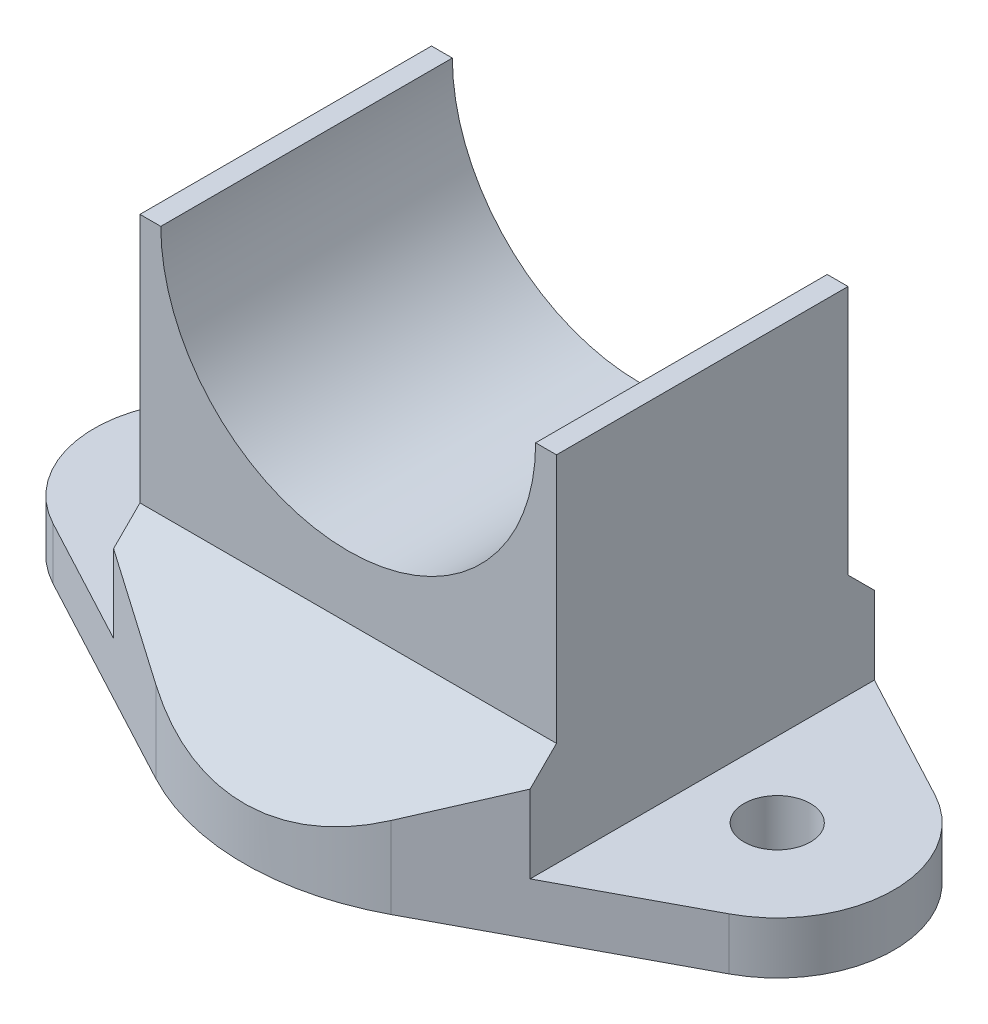
ISO-10303-21;
HEADER;
FILE_DESCRIPTION(('STEP AP214'),'2;1');
FILE_NAME('part.step','',(''),(''),'','','');
FILE_SCHEMA(('AUTOMOTIVE_DESIGN { 1 0 10303 214 1 1 1 1 }'));
ENDSEC;
DATA;
#1=APPLICATION_CONTEXT('core data for automotive mechanical design processes');
#2=APPLICATION_PROTOCOL_DEFINITION('international standard','automotive_design',2000,#1);
#3=PRODUCT_CONTEXT('',#1,'mechanical');
#4=PRODUCT('Part','Part','',(#3));
#5=PRODUCT_RELATED_PRODUCT_CATEGORY('part','',(#4));
#6=PRODUCT_DEFINITION_FORMATION('','',#4);
#7=PRODUCT_DEFINITION_CONTEXT('part definition',#1,'design');
#8=PRODUCT_DEFINITION('design','',#6,#7);
#9=PRODUCT_DEFINITION_SHAPE('','',#8);
#10=(LENGTH_UNIT() NAMED_UNIT(*) SI_UNIT(.MILLI.,.METRE.));
#11=(NAMED_UNIT(*) PLANE_ANGLE_UNIT() SI_UNIT($,.RADIAN.));
#12=(NAMED_UNIT(*) SI_UNIT($,.STERADIAN.) SOLID_ANGLE_UNIT());
#13=UNCERTAINTY_MEASURE_WITH_UNIT(LENGTH_MEASURE(1.E-05),#10,'distance_accuracy_value','');
#14=(GEOMETRIC_REPRESENTATION_CONTEXT(3) GLOBAL_UNCERTAINTY_ASSIGNED_CONTEXT((#13)) GLOBAL_UNIT_ASSIGNED_CONTEXT((#10,
#11,#12)) REPRESENTATION_CONTEXT('',''));
#15=CARTESIAN_POINT('',(0.,0.,0.));
#16=DIRECTION('',(0.,0.,1.));
#17=DIRECTION('',(1.,0.,0.));
#18=AXIS2_PLACEMENT_3D('',#15,#16,#17);
#19=CARTESIAN_POINT('',(-10.,17.,7.));
#20=DIRECTION('',(0.,1.,0.));
#21=DIRECTION('',(0.,0.,1.));
#22=AXIS2_PLACEMENT_3D('',#19,#20,#21);
#23=PLANE('',#22);
#24=DIRECTION('',(1.,0.,0.));
#25=VECTOR('',#24,1.);
#26=CARTESIAN_POINT('',(-10.,17.,-7.));
#27=LINE('',#26,#25);
#28=CARTESIAN_POINT('',(9.,17.,-7.));
#29=VERTEX_POINT('',#28);
#30=CARTESIAN_POINT('',(10.,17.,-7.));
#31=VERTEX_POINT('',#30);
#32=EDGE_CURVE('E177',#29,#31,#27,.T.);
#33=ORIENTED_EDGE('',*,*,#32,.F.);
#34=DIRECTION('',(0.,0.,-1.));
#35=VECTOR('',#34,1.);
#36=CARTESIAN_POINT('',(9.,17.,12.));
#37=LINE('',#36,#35);
#38=CARTESIAN_POINT('',(9.,17.,7.));
#39=VERTEX_POINT('',#38);
#40=EDGE_CURVE('E50',#29,#39,#37,.F.);
#41=ORIENTED_EDGE('',*,*,#40,.T.);
#42=DIRECTION('',(1.,0.,0.));
#43=VECTOR('',#42,1.);
#44=CARTESIAN_POINT('',(-10.,17.,7.));
#45=LINE('',#44,#43);
#46=CARTESIAN_POINT('',(10.,17.,7.));
#47=VERTEX_POINT('',#46);
#48=EDGE_CURVE('E176',#39,#47,#45,.T.);
#49=ORIENTED_EDGE('',*,*,#48,.T.);
#50=DIRECTION('',(0.,0.,1.));
#51=VECTOR('',#50,1.);
#52=CARTESIAN_POINT('',(10.,17.,7.));
#53=LINE('',#52,#51);
#54=EDGE_CURVE('E297',#31,#47,#53,.T.);
#55=ORIENTED_EDGE('',*,*,#54,.F.);
#56=EDGE_LOOP('',(#33,#41,#49,#55));
#57=FACE_BOUND('',#56,.T.);
#58=ADVANCED_FACE('F35',(#57),#23,.T.);
#59=CARTESIAN_POINT('',(-10.,17.,7.));
#60=VERTEX_POINT('',#59);
#61=CARTESIAN_POINT('',(-9.,17.,7.));
#62=VERTEX_POINT('',#61);
#63=EDGE_CURVE('E169',#60,#62,#45,.T.);
#64=ORIENTED_EDGE('',*,*,#63,.T.);
#65=DIRECTION('',(0.,0.,-1.));
#66=VECTOR('',#65,1.);
#67=CARTESIAN_POINT('',(-9.,17.,12.));
#68=LINE('',#67,#66);
#69=CARTESIAN_POINT('',(-9.,17.,-7.));
#70=VERTEX_POINT('',#69);
#71=EDGE_CURVE('E158',#62,#70,#68,.T.);
#72=ORIENTED_EDGE('',*,*,#71,.T.);
#73=CARTESIAN_POINT('',(-10.,17.,-7.));
#74=VERTEX_POINT('',#73);
#75=EDGE_CURVE('E167',#74,#70,#27,.T.);
#76=ORIENTED_EDGE('',*,*,#75,.F.);
#77=DIRECTION('',(0.,0.,1.));
#78=VECTOR('',#77,1.);
#79=CARTESIAN_POINT('',(-10.,17.,7.));
#80=LINE('',#79,#78);
#81=EDGE_CURVE('E311',#74,#60,#80,.T.);
#82=ORIENTED_EDGE('',*,*,#81,.T.);
#83=EDGE_LOOP('',(#64,#72,#76,#82));
#84=FACE_BOUND('',#83,.T.);
#85=ADVANCED_FACE('F165',(#84),#23,.T.);
#86=CARTESIAN_POINT('',(-10.,5.,7.));
#87=DIRECTION('',(0.,0.707106781186547,0.707106781186548));
#88=DIRECTION('',(0.,-0.707106781186548,0.707106781186547));
#89=AXIS2_PLACEMENT_3D('',#86,#87,#88);
#90=PLANE('',#89);
#91=DIRECTION('',(-0.798369443118525,-0.425797036329879,0.425797036329879));
#92=VECTOR('',#91,1.);
#93=CARTESIAN_POINT('',(-1.88668555240795,-2.60623229461756,14.6062322946176));
#94=LINE('',#93,#92);
#95=CARTESIAN_POINT('',(10.,3.73333333333334,8.26666666666666));
#96=VERTEX_POINT('',#95);
#97=CARTESIAN_POINT('',(5.64705882352941,1.41176470588235,10.5882352941176));
#98=VERTEX_POINT('',#97);
#99=EDGE_CURVE('E282',#96,#98,#94,.T.);
#100=ORIENTED_EDGE('',*,*,#99,.F.);
#101=DIRECTION('',(0.,-0.707106781186548,0.707106781186547));
#102=VECTOR('',#101,1.);
#103=CARTESIAN_POINT('',(10.,5.,7.));
#104=LINE('',#103,#102);
#105=CARTESIAN_POINT('',(10.,5.,7.));
#106=VERTEX_POINT('',#105);
#107=EDGE_CURVE('E303',#106,#96,#104,.T.);
#108=ORIENTED_EDGE('',*,*,#107,.F.);
#109=DIRECTION('',(1.,0.,0.));
#110=VECTOR('',#109,1.);
#111=CARTESIAN_POINT('',(-10.,5.,7.));
#112=LINE('',#111,#110);
#113=CARTESIAN_POINT('',(-10.,5.,7.));
#114=VERTEX_POINT('',#113);
#115=EDGE_CURVE('E193',#114,#106,#112,.T.);
#116=ORIENTED_EDGE('',*,*,#115,.F.);
#117=DIRECTION('',(0.,-0.707106781186548,0.707106781186547));
#118=VECTOR('',#117,1.);
#119=CARTESIAN_POINT('',(-10.,5.,7.));
#120=LINE('',#119,#118);
#121=CARTESIAN_POINT('',(-10.,3.73333333333334,8.26666666666666));
#122=VERTEX_POINT('',#121);
#123=EDGE_CURVE('E185',#114,#122,#120,.T.);
#124=ORIENTED_EDGE('',*,*,#123,.T.);
#125=DIRECTION('',(-0.798369443118524,0.42579703632988,-0.425797036329879));
#126=VECTOR('',#125,1.);
#127=CARTESIAN_POINT('',(-10.8611898016997,4.19263456090652,7.80736543909348));
#128=LINE('',#127,#126);
#129=CARTESIAN_POINT('',(-5.64705882352941,1.41176470588235,10.5882352941176));
#130=VERTEX_POINT('',#129);
#131=EDGE_CURVE('E276',#130,#122,#128,.T.);
#132=ORIENTED_EDGE('',*,*,#131,.F.);
#133=CARTESIAN_POINT('',(0.,12.,0.));
#134=DIRECTION('',(0.,0.707106781186547,0.707106781186548));
#135=DIRECTION('',(0.,-0.707106781186548,0.707106781186547));
#136=AXIS2_PLACEMENT_3D('',#133,#134,#135);
#137=ELLIPSE('',#136,16.9705627484771,12.);
#138=EDGE_CURVE('E43',#98,#130,#137,.F.);
#139=ORIENTED_EDGE('',*,*,#138,.F.);
#140=EDGE_LOOP('',(#100,#108,#116,#124,#132,#139));
#141=FACE_BOUND('',#140,.T.);
#142=ADVANCED_FACE('F277',(#141),#90,.T.);
#143=CARTESIAN_POINT('',(-13.6,0.,0.));
#144=DIRECTION('',(0.,1.,0.));
#145=DIRECTION('',(0.,0.,1.));
#146=AXIS2_PLACEMENT_3D('',#143,#144,#145);
#147=PLANE('',#146);
#148=CARTESIAN_POINT('',(-13.6,0.,0.));
#149=DIRECTION('',(0.,1.,0.));
#150=DIRECTION('',(0.,0.,1.));
#151=AXIS2_PLACEMENT_3D('',#148,#149,#150);
#152=CIRCLE('',#151,1.6);
#153=CARTESIAN_POINT('',(-13.6,0.,1.6));
#154=VERTEX_POINT('',#153);
#155=EDGE_CURVE('E189',#154,#154,#152,.T.);
#156=ORIENTED_EDGE('',*,*,#155,.F.);
#157=EDGE_LOOP('',(#156));
#158=FACE_BOUND('',#157,.T.);
#159=DIRECTION('',(0.882352941176471,0.,0.470588235294117));
#160=VECTOR('',#159,1.);
#161=CARTESIAN_POINT('',(-16.2352941176471,0.,4.94117647058824));
#162=LINE('',#161,#160);
#163=CARTESIAN_POINT('',(-16.2352941176471,0.,4.94117647058824));
#164=VERTEX_POINT('',#163);
#165=CARTESIAN_POINT('',(-10.,0.,8.26666666666666));
#166=VERTEX_POINT('',#165);
#167=EDGE_CURVE('E228',#164,#166,#162,.T.);
#168=ORIENTED_EDGE('',*,*,#167,.T.);
#169=DIRECTION('',(0.,0.,-1.));
#170=VECTOR('',#169,1.);
#171=CARTESIAN_POINT('',(-10.,0.,-12.));
#172=LINE('',#171,#170);
#173=CARTESIAN_POINT('',(-10.,0.,-8.26666666666667));
#174=VERTEX_POINT('',#173);
#175=EDGE_CURVE('E243',#166,#174,#172,.T.);
#176=ORIENTED_EDGE('',*,*,#175,.T.);
#177=DIRECTION('',(-0.88235294117647,0.,0.470588235294118));
#178=VECTOR('',#177,1.);
#179=CARTESIAN_POINT('',(-16.2352941176471,0.,-4.94117647058823));
#180=LINE('',#179,#178);
#181=CARTESIAN_POINT('',(-16.2352941176471,0.,-4.94117647058823));
#182=VERTEX_POINT('',#181);
#183=EDGE_CURVE('E204',#174,#182,#180,.T.);
#184=ORIENTED_EDGE('',*,*,#183,.T.);
#185=CARTESIAN_POINT('',(-13.6,0.,0.));
#186=DIRECTION('',(0.,1.,0.));
#187=DIRECTION('',(0.,0.,1.));
#188=AXIS2_PLACEMENT_3D('',#185,#186,#187);
#189=CIRCLE('',#188,5.6);
#190=EDGE_CURVE('E197',#182,#164,#189,.T.);
#191=ORIENTED_EDGE('',*,*,#190,.T.);
#192=EDGE_LOOP('',(#168,#176,#184,#191));
#193=FACE_BOUND('',#192,.T.);
#194=ADVANCED_FACE('F358',(#158,#193),#147,.T.);
#195=CARTESIAN_POINT('',(-13.6,-2.5,0.));
#196=DIRECTION('',(0.,1.,0.));
#197=DIRECTION('',(0.,0.,1.));
#198=AXIS2_PLACEMENT_3D('',#195,#196,#197);
#199=CYLINDRICAL_SURFACE('',#198,5.6);
#200=ORIENTED_EDGE('',*,*,#190,.F.);
#201=DIRECTION('',(0.,1.,0.));
#202=VECTOR('',#201,1.);
#203=CARTESIAN_POINT('',(-16.2352941176471,-2.5,-4.94117647058823));
#204=LINE('',#203,#202);
#205=CARTESIAN_POINT('',(-16.2352941176471,-2.5,-4.94117647058823));
#206=VERTEX_POINT('',#205);
#207=EDGE_CURVE('E240',#206,#182,#204,.T.);
#208=ORIENTED_EDGE('',*,*,#207,.F.);
#209=CARTESIAN_POINT('',(-13.6,-2.5,0.));
#210=DIRECTION('',(0.,1.,0.));
#211=DIRECTION('',(0.,0.,1.));
#212=AXIS2_PLACEMENT_3D('',#209,#210,#211);
#213=CIRCLE('',#212,5.6);
#214=CARTESIAN_POINT('',(-16.2352941176471,-2.5,4.94117647058824));
#215=VERTEX_POINT('',#214);
#216=EDGE_CURVE('E200',#206,#215,#213,.T.);
#217=ORIENTED_EDGE('',*,*,#216,.T.);
#218=DIRECTION('',(0.,1.,0.));
#219=VECTOR('',#218,1.);
#220=CARTESIAN_POINT('',(-16.2352941176471,-2.5,4.94117647058824));
#221=LINE('',#220,#219);
#222=EDGE_CURVE('E225',#215,#164,#221,.T.);
#223=ORIENTED_EDGE('',*,*,#222,.T.);
#224=EDGE_LOOP('',(#200,#208,#217,#223));
#225=FACE_BOUND('',#224,.T.);
#226=ADVANCED_FACE('F37',(#225),#199,.T.);
#227=CARTESIAN_POINT('',(-16.2352941176471,-2.5,-4.94117647058823));
#228=DIRECTION('',(-0.470588235294118,0.,-0.882352941176471));
#229=DIRECTION('',(-0.882352941176471,0.,0.470588235294118));
#230=AXIS2_PLACEMENT_3D('',#227,#228,#229);
#231=PLANE('',#230);
#232=ORIENTED_EDGE('',*,*,#183,.F.);
#233=DIRECTION('',(0.,1.,0.));
#234=VECTOR('',#233,1.);
#235=CARTESIAN_POINT('',(-10.,0.,-8.26666666666667));
#236=LINE('',#235,#234);
#237=CARTESIAN_POINT('',(-10.,3.73333333333334,-8.26666666666667));
#238=VERTEX_POINT('',#237);
#239=EDGE_CURVE('E265',#174,#238,#236,.T.);
#240=ORIENTED_EDGE('',*,*,#239,.T.);
#241=DIRECTION('',(0.798369443118524,-0.42579703632988,-0.425797036329879));
#242=VECTOR('',#241,1.);
#243=CARTESIAN_POINT('',(-10.8611898016997,4.19263456090652,-7.80736543909348));
#244=LINE('',#243,#242);
#245=CARTESIAN_POINT('',(-5.64705882352941,1.41176470588235,-10.5882352941176));
#246=VERTEX_POINT('',#245);
#247=EDGE_CURVE('E281',#238,#246,#244,.T.);
#248=ORIENTED_EDGE('',*,*,#247,.T.);
#249=DIRECTION('',(0.,1.,0.));
#250=VECTOR('',#249,1.);
#251=CARTESIAN_POINT('',(-5.64705882352941,-2.5,-10.5882352941176));
#252=LINE('',#251,#250);
#253=CARTESIAN_POINT('',(-5.64705882352941,-2.5,-10.5882352941176));
#254=VERTEX_POINT('',#253);
#255=EDGE_CURVE('E244',#254,#246,#252,.T.);
#256=ORIENTED_EDGE('',*,*,#255,.F.);
#257=DIRECTION('',(-0.88235294117647,0.,0.470588235294118));
#258=VECTOR('',#257,1.);
#259=CARTESIAN_POINT('',(-16.2352941176471,-2.5,-4.94117647058823));
#260=LINE('',#259,#258);
#261=EDGE_CURVE('E222',#254,#206,#260,.T.);
#262=ORIENTED_EDGE('',*,*,#261,.T.);
#263=ORIENTED_EDGE('',*,*,#207,.T.);
#264=EDGE_LOOP('',(#232,#240,#248,#256,#262,#263));
#265=FACE_BOUND('',#264,.T.);
#266=ADVANCED_FACE('F367',(#265),#231,.T.);
#267=CARTESIAN_POINT('',(0.,-2.5,0.));
#268=DIRECTION('',(0.,1.,0.));
#269=DIRECTION('',(0.,0.,1.));
#270=AXIS2_PLACEMENT_3D('',#267,#268,#269);
#271=CYLINDRICAL_SURFACE('',#270,12.);
#272=CARTESIAN_POINT('',(0.,12.,0.));
#273=DIRECTION('',(0.,0.707106781186547,-0.707106781186548));
#274=DIRECTION('',(0.,-0.707106781186548,-0.707106781186547));
#275=AXIS2_PLACEMENT_3D('',#272,#273,#274);
#276=ELLIPSE('',#275,16.9705627484771,12.);
#277=CARTESIAN_POINT('',(5.64705882352941,1.41176470588235,-10.5882352941176));
#278=VERTEX_POINT('',#277);
#279=EDGE_CURVE('E285',#246,#278,#276,.F.);
#280=ORIENTED_EDGE('',*,*,#279,.T.);
#281=DIRECTION('',(0.,1.,0.));
#282=VECTOR('',#281,1.);
#283=CARTESIAN_POINT('',(5.64705882352941,-2.5,-10.5882352941176));
#284=LINE('',#283,#282);
#285=CARTESIAN_POINT('',(5.64705882352941,-2.5,-10.5882352941176));
#286=VERTEX_POINT('',#285);
#287=EDGE_CURVE('E246',#286,#278,#284,.T.);
#288=ORIENTED_EDGE('',*,*,#287,.F.);
#289=CARTESIAN_POINT('',(0.,-2.5,0.));
#290=DIRECTION('',(0.,1.,0.));
#291=DIRECTION('',(0.,0.,1.));
#292=AXIS2_PLACEMENT_3D('',#289,#290,#291);
#293=CIRCLE('',#292,12.);
#294=EDGE_CURVE('E219',#286,#254,#293,.T.);
#295=ORIENTED_EDGE('',*,*,#294,.T.);
#296=ORIENTED_EDGE('',*,*,#255,.T.);
#297=EDGE_LOOP('',(#280,#288,#295,#296));
#298=FACE_BOUND('',#297,.T.);
#299=ADVANCED_FACE('F369',(#298),#271,.T.);
#300=CARTESIAN_POINT('',(16.2352941176471,-2.5,-4.94117647058823));
#301=DIRECTION('',(0.470588235294118,0.,-0.882352941176471));
#302=DIRECTION('',(-0.882352941176471,0.,-0.470588235294118));
#303=AXIS2_PLACEMENT_3D('',#300,#301,#302);
#304=PLANE('',#303);
#305=DIRECTION('',(-0.88235294117647,0.,-0.470588235294118));
#306=VECTOR('',#305,1.);
#307=CARTESIAN_POINT('',(16.2352941176471,0.,-4.94117647058823));
#308=LINE('',#307,#306);
#309=CARTESIAN_POINT('',(16.2352941176471,0.,-4.94117647058823));
#310=VERTEX_POINT('',#309);
#311=CARTESIAN_POINT('',(10.,0.,-8.26666666666667));
#312=VERTEX_POINT('',#311);
#313=EDGE_CURVE('E236',#310,#312,#308,.T.);
#314=ORIENTED_EDGE('',*,*,#313,.F.);
#315=DIRECTION('',(0.,1.,0.));
#316=VECTOR('',#315,1.);
#317=CARTESIAN_POINT('',(16.2352941176471,-2.5,-4.94117647058823));
#318=LINE('',#317,#316);
#319=CARTESIAN_POINT('',(16.2352941176471,-2.5,-4.94117647058823));
#320=VERTEX_POINT('',#319);
#321=EDGE_CURVE('E248',#320,#310,#318,.T.);
#322=ORIENTED_EDGE('',*,*,#321,.F.);
#323=DIRECTION('',(-0.88235294117647,0.,-0.470588235294118));
#324=VECTOR('',#323,1.);
#325=CARTESIAN_POINT('',(16.2352941176471,-2.5,-4.94117647058823));
#326=LINE('',#325,#324);
#327=EDGE_CURVE('E216',#320,#286,#326,.T.);
#328=ORIENTED_EDGE('',*,*,#327,.T.);
#329=ORIENTED_EDGE('',*,*,#287,.T.);
#330=DIRECTION('',(0.798369443118524,0.42579703632988,0.425797036329879));
#331=VECTOR('',#330,1.);
#332=CARTESIAN_POINT('',(-1.88668555240793,-2.60623229461756,-14.6062322946176));
#333=LINE('',#332,#331);
#334=CARTESIAN_POINT('',(10.,3.73333333333334,-8.26666666666667));
#335=VERTEX_POINT('',#334);
#336=EDGE_CURVE('E57',#278,#335,#333,.T.);
#337=ORIENTED_EDGE('',*,*,#336,.T.);
#338=DIRECTION('',(0.,1.,0.));
#339=VECTOR('',#338,1.);
#340=CARTESIAN_POINT('',(10.,0.,-8.26666666666667));
#341=LINE('',#340,#339);
#342=EDGE_CURVE('E258',#312,#335,#341,.T.);
#343=ORIENTED_EDGE('',*,*,#342,.F.);
#344=EDGE_LOOP('',(#314,#322,#328,#329,#337,#343));
#345=FACE_BOUND('',#344,.T.);
#346=ADVANCED_FACE('F337',(#345),#304,.T.);
#347=CARTESIAN_POINT('',(13.6,-2.5,0.));
#348=DIRECTION('',(0.,1.,0.));
#349=DIRECTION('',(0.,0.,1.));
#350=AXIS2_PLACEMENT_3D('',#347,#348,#349);
#351=CYLINDRICAL_SURFACE('',#350,5.6);
#352=CARTESIAN_POINT('',(13.6,0.,0.));
#353=DIRECTION('',(0.,1.,0.));
#354=DIRECTION('',(0.,0.,1.));
#355=AXIS2_PLACEMENT_3D('',#352,#353,#354);
#356=CIRCLE('',#355,5.6);
#357=CARTESIAN_POINT('',(16.2352941176471,0.,4.94117647058824));
#358=VERTEX_POINT('',#357);
#359=EDGE_CURVE('E233',#358,#310,#356,.T.);
#360=ORIENTED_EDGE('',*,*,#359,.F.);
#361=DIRECTION('',(0.,1.,0.));
#362=VECTOR('',#361,1.);
#363=CARTESIAN_POINT('',(16.2352941176471,-2.5,4.94117647058824));
#364=LINE('',#363,#362);
#365=CARTESIAN_POINT('',(16.2352941176471,-2.5,4.94117647058824));
#366=VERTEX_POINT('',#365);
#367=EDGE_CURVE('E250',#366,#358,#364,.T.);
#368=ORIENTED_EDGE('',*,*,#367,.F.);
#369=CARTESIAN_POINT('',(13.6,-2.5,0.));
#370=DIRECTION('',(0.,1.,0.));
#371=DIRECTION('',(0.,0.,1.));
#372=AXIS2_PLACEMENT_3D('',#369,#370,#371);
#373=CIRCLE('',#372,5.6);
#374=EDGE_CURVE('E213',#366,#320,#373,.T.);
#375=ORIENTED_EDGE('',*,*,#374,.T.);
#376=ORIENTED_EDGE('',*,*,#321,.T.);
#377=EDGE_LOOP('',(#360,#368,#375,#376));
#378=FACE_BOUND('',#377,.T.);
#379=ADVANCED_FACE('F372',(#378),#351,.T.);
#380=CARTESIAN_POINT('',(16.2352941176471,-2.5,4.94117647058824));
#381=DIRECTION('',(0.470588235294117,0.,0.882352941176471));
#382=DIRECTION('',(0.882352941176471,0.,-0.470588235294117));
#383=AXIS2_PLACEMENT_3D('',#380,#381,#382);
#384=PLANE('',#383);
#385=DIRECTION('',(0.882352941176471,0.,-0.470588235294117));
#386=VECTOR('',#385,1.);
#387=CARTESIAN_POINT('',(16.2352941176471,0.,4.94117647058824));
#388=LINE('',#387,#386);
#389=CARTESIAN_POINT('',(10.,0.,8.26666666666666));
#390=VERTEX_POINT('',#389);
#391=EDGE_CURVE('E231',#390,#358,#388,.T.);
#392=ORIENTED_EDGE('',*,*,#391,.F.);
#393=DIRECTION('',(0.,-1.,0.));
#394=VECTOR('',#393,1.);
#395=CARTESIAN_POINT('',(10.,0.,8.26666666666666));
#396=LINE('',#395,#394);
#397=EDGE_CURVE('E260',#96,#390,#396,.T.);
#398=ORIENTED_EDGE('',*,*,#397,.F.);
#399=ORIENTED_EDGE('',*,*,#99,.T.);
#400=DIRECTION('',(0.,1.,0.));
#401=VECTOR('',#400,1.);
#402=CARTESIAN_POINT('',(5.64705882352941,-2.5,10.5882352941176));
#403=LINE('',#402,#401);
#404=CARTESIAN_POINT('',(5.64705882352941,-2.5,10.5882352941176));
#405=VERTEX_POINT('',#404);
#406=EDGE_CURVE('E253',#405,#98,#403,.T.);
#407=ORIENTED_EDGE('',*,*,#406,.F.);
#408=DIRECTION('',(0.882352941176471,0.,-0.470588235294117));
#409=VECTOR('',#408,1.);
#410=CARTESIAN_POINT('',(16.2352941176471,-2.5,4.94117647058824));
#411=LINE('',#410,#409);
#412=EDGE_CURVE('E210',#405,#366,#411,.T.);
#413=ORIENTED_EDGE('',*,*,#412,.T.);
#414=ORIENTED_EDGE('',*,*,#367,.T.);
#415=EDGE_LOOP('',(#392,#398,#399,#407,#413,#414));
#416=FACE_BOUND('',#415,.T.);
#417=ADVANCED_FACE('F329',(#416),#384,.T.);
#418=CARTESIAN_POINT('',(0.,-2.5,0.));
#419=DIRECTION('',(0.,1.,0.));
#420=DIRECTION('',(0.,0.,1.));
#421=AXIS2_PLACEMENT_3D('',#418,#419,#420);
#422=CYLINDRICAL_SURFACE('',#421,12.);
#423=ORIENTED_EDGE('',*,*,#138,.T.);
#424=DIRECTION('',(0.,1.,0.));
#425=VECTOR('',#424,1.);
#426=CARTESIAN_POINT('',(-5.64705882352941,-2.5,10.5882352941176));
#427=LINE('',#426,#425);
#428=CARTESIAN_POINT('',(-5.64705882352941,-2.5,10.5882352941176));
#429=VERTEX_POINT('',#428);
#430=EDGE_CURVE('E255',#429,#130,#427,.T.);
#431=ORIENTED_EDGE('',*,*,#430,.F.);
#432=CARTESIAN_POINT('',(0.,-2.5,0.));
#433=DIRECTION('',(0.,1.,0.));
#434=DIRECTION('',(0.,0.,1.));
#435=AXIS2_PLACEMENT_3D('',#432,#433,#434);
#436=CIRCLE('',#435,12.);
#437=EDGE_CURVE('E207',#429,#405,#436,.T.);
#438=ORIENTED_EDGE('',*,*,#437,.T.);
#439=ORIENTED_EDGE('',*,*,#406,.T.);
#440=EDGE_LOOP('',(#423,#431,#438,#439));
#441=FACE_BOUND('',#440,.T.);
#442=ADVANCED_FACE('F270',(#441),#422,.T.);
#443=CARTESIAN_POINT('',(-16.2352941176471,-2.5,4.94117647058824));
#444=DIRECTION('',(-0.470588235294117,0.,0.882352941176471));
#445=DIRECTION('',(0.882352941176471,0.,0.470588235294117));
#446=AXIS2_PLACEMENT_3D('',#443,#444,#445);
#447=PLANE('',#446);
#448=ORIENTED_EDGE('',*,*,#167,.F.);
#449=ORIENTED_EDGE('',*,*,#222,.F.);
#450=DIRECTION('',(0.882352941176471,0.,0.470588235294117));
#451=VECTOR('',#450,1.);
#452=CARTESIAN_POINT('',(-16.2352941176471,-2.5,4.94117647058824));
#453=LINE('',#452,#451);
#454=EDGE_CURVE('E203',#215,#429,#453,.T.);
#455=ORIENTED_EDGE('',*,*,#454,.T.);
#456=ORIENTED_EDGE('',*,*,#430,.T.);
#457=ORIENTED_EDGE('',*,*,#131,.T.);
#458=DIRECTION('',(0.,-1.,0.));
#459=VECTOR('',#458,1.);
#460=CARTESIAN_POINT('',(-10.,0.,8.26666666666666));
#461=LINE('',#460,#459);
#462=EDGE_CURVE('E263',#122,#166,#461,.T.);
#463=ORIENTED_EDGE('',*,*,#462,.T.);
#464=EDGE_LOOP('',(#448,#449,#455,#456,#457,#463));
#465=FACE_BOUND('',#464,.T.);
#466=ADVANCED_FACE('F354',(#465),#447,.T.);
#467=CARTESIAN_POINT('',(-13.6,-2.5,0.));
#468=DIRECTION('',(0.,1.,0.));
#469=DIRECTION('',(0.,0.,1.));
#470=AXIS2_PLACEMENT_3D('',#467,#468,#469);
#471=PLANE('',#470);
#472=CARTESIAN_POINT('',(13.6,-2.5,0.));
#473=DIRECTION('',(0.,1.,0.));
#474=DIRECTION('',(0.,0.,1.));
#475=AXIS2_PLACEMENT_3D('',#472,#473,#474);
#476=CIRCLE('',#475,1.6);
#477=CARTESIAN_POINT('',(13.6,-2.5,1.6));
#478=VERTEX_POINT('',#477);
#479=EDGE_CURVE('E186',#478,#478,#476,.T.);
#480=ORIENTED_EDGE('',*,*,#479,.T.);
#481=EDGE_LOOP('',(#480));
#482=FACE_BOUND('',#481,.T.);
#483=CARTESIAN_POINT('',(-13.6,-2.5,0.));
#484=DIRECTION('',(0.,1.,0.));
#485=DIRECTION('',(0.,0.,1.));
#486=AXIS2_PLACEMENT_3D('',#483,#484,#485);
#487=CIRCLE('',#486,1.6);
#488=CARTESIAN_POINT('',(-13.6,-2.5,1.6));
#489=VERTEX_POINT('',#488);
#490=EDGE_CURVE('E194',#489,#489,#487,.T.);
#491=ORIENTED_EDGE('',*,*,#490,.T.);
#492=EDGE_LOOP('',(#491));
#493=FACE_BOUND('',#492,.T.);
#494=ORIENTED_EDGE('',*,*,#216,.F.);
#495=ORIENTED_EDGE('',*,*,#261,.F.);
#496=ORIENTED_EDGE('',*,*,#294,.F.);
#497=ORIENTED_EDGE('',*,*,#327,.F.);
#498=ORIENTED_EDGE('',*,*,#374,.F.);
#499=ORIENTED_EDGE('',*,*,#412,.F.);
#500=ORIENTED_EDGE('',*,*,#437,.F.);
#501=ORIENTED_EDGE('',*,*,#454,.F.);
#502=EDGE_LOOP('',(#494,#495,#496,#497,#498,#499,#500,#501));
#503=FACE_BOUND('',#502,.T.);
#504=ADVANCED_FACE('F364',(#482,#493,#503),#471,.F.);
#505=DIRECTION('',(0.,0.,-1.));
#506=VECTOR('',#505,1.);
#507=CARTESIAN_POINT('',(10.,0.,-12.));
#508=LINE('',#507,#506);
#509=EDGE_CURVE('E261',#390,#312,#508,.T.);
#510=ORIENTED_EDGE('',*,*,#509,.F.);
#511=ORIENTED_EDGE('',*,*,#391,.T.);
#512=ORIENTED_EDGE('',*,*,#359,.T.);
#513=ORIENTED_EDGE('',*,*,#313,.T.);
#514=EDGE_LOOP('',(#510,#511,#512,#513));
#515=FACE_BOUND('',#514,.T.);
#516=CARTESIAN_POINT('',(13.6,0.,0.));
#517=DIRECTION('',(0.,1.,0.));
#518=DIRECTION('',(0.,0.,1.));
#519=AXIS2_PLACEMENT_3D('',#516,#517,#518);
#520=CIRCLE('',#519,1.6);
#521=CARTESIAN_POINT('',(13.6,0.,1.6));
#522=VERTEX_POINT('',#521);
#523=EDGE_CURVE('E190',#522,#522,#520,.T.);
#524=ORIENTED_EDGE('',*,*,#523,.F.);
#525=EDGE_LOOP('',(#524));
#526=FACE_BOUND('',#525,.T.);
#527=ADVANCED_FACE('F333',(#515,#526),#147,.T.);
#528=CARTESIAN_POINT('',(-13.6,-2.5,0.));
#529=DIRECTION('',(0.,1.,0.));
#530=DIRECTION('',(0.,0.,1.));
#531=AXIS2_PLACEMENT_3D('',#528,#529,#530);
#532=CYLINDRICAL_SURFACE('',#531,1.6);
#533=ORIENTED_EDGE('',*,*,#490,.F.);
#534=EDGE_LOOP('',(#533));
#535=FACE_BOUND('',#534,.T.);
#536=ORIENTED_EDGE('',*,*,#155,.T.);
#537=EDGE_LOOP('',(#536));
#538=FACE_BOUND('',#537,.T.);
#539=ADVANCED_FACE('F396',(#535,#538),#532,.F.);
#540=CARTESIAN_POINT('',(13.6,-2.5,0.));
#541=DIRECTION('',(0.,1.,0.));
#542=DIRECTION('',(0.,0.,1.));
#543=AXIS2_PLACEMENT_3D('',#540,#541,#542);
#544=CYLINDRICAL_SURFACE('',#543,1.6);
#545=ORIENTED_EDGE('',*,*,#479,.F.);
#546=EDGE_LOOP('',(#545));
#547=FACE_BOUND('',#546,.T.);
#548=ORIENTED_EDGE('',*,*,#523,.T.);
#549=EDGE_LOOP('',(#548));
#550=FACE_BOUND('',#549,.T.);
#551=ADVANCED_FACE('F393',(#547,#550),#544,.F.);
#552=CARTESIAN_POINT('',(-10.,5.,-7.));
#553=DIRECTION('',(0.,0.707106781186547,-0.707106781186548));
#554=DIRECTION('',(0.,0.707106781186548,0.707106781186547));
#555=AXIS2_PLACEMENT_3D('',#552,#553,#554);
#556=PLANE('',#555);
#557=ORIENTED_EDGE('',*,*,#336,.F.);
#558=ORIENTED_EDGE('',*,*,#279,.F.);
#559=ORIENTED_EDGE('',*,*,#247,.F.);
#560=DIRECTION('',(0.,0.707106781186548,0.707106781186547));
#561=VECTOR('',#560,1.);
#562=CARTESIAN_POINT('',(-10.,5.,-7.));
#563=LINE('',#562,#561);
#564=CARTESIAN_POINT('',(-10.,5.,-7.));
#565=VERTEX_POINT('',#564);
#566=EDGE_CURVE('E306',#238,#565,#563,.T.);
#567=ORIENTED_EDGE('',*,*,#566,.T.);
#568=DIRECTION('',(1.,0.,0.));
#569=VECTOR('',#568,1.);
#570=CARTESIAN_POINT('',(-10.,5.,-7.));
#571=LINE('',#570,#569);
#572=CARTESIAN_POINT('',(10.,5.,-7.));
#573=VERTEX_POINT('',#572);
#574=EDGE_CURVE('E180',#565,#573,#571,.T.);
#575=ORIENTED_EDGE('',*,*,#574,.T.);
#576=DIRECTION('',(0.,0.707106781186548,0.707106781186547));
#577=VECTOR('',#576,1.);
#578=CARTESIAN_POINT('',(10.,5.,-7.));
#579=LINE('',#578,#577);
#580=EDGE_CURVE('E292',#335,#573,#579,.T.);
#581=ORIENTED_EDGE('',*,*,#580,.F.);
#582=EDGE_LOOP('',(#557,#558,#559,#567,#575,#581));
#583=FACE_BOUND('',#582,.T.);
#584=ADVANCED_FACE('F341',(#583),#556,.T.);
#585=CARTESIAN_POINT('',(-10.,5.,7.));
#586=DIRECTION('',(0.,0.,1.));
#587=DIRECTION('',(1.,0.,0.));
#588=AXIS2_PLACEMENT_3D('',#585,#586,#587);
#589=PLANE('',#588);
#590=ORIENTED_EDGE('',*,*,#48,.F.);
#591=CARTESIAN_POINT('',(0.,17.,7.));
#592=DIRECTION('',(0.,0.,1.));
#593=DIRECTION('',(1.,0.,0.));
#594=AXIS2_PLACEMENT_3D('',#591,#592,#593);
#595=CIRCLE('',#594,9.);
#596=EDGE_CURVE('E347',#39,#62,#595,.F.);
#597=ORIENTED_EDGE('',*,*,#596,.T.);
#598=ORIENTED_EDGE('',*,*,#63,.F.);
#599=DIRECTION('',(0.,-1.,0.));
#600=VECTOR('',#599,1.);
#601=CARTESIAN_POINT('',(-10.,5.,7.));
#602=LINE('',#601,#600);
#603=EDGE_CURVE('E313',#60,#114,#602,.T.);
#604=ORIENTED_EDGE('',*,*,#603,.T.);
#605=ORIENTED_EDGE('',*,*,#115,.T.);
#606=DIRECTION('',(0.,-1.,0.));
#607=VECTOR('',#606,1.);
#608=CARTESIAN_POINT('',(10.,5.,7.));
#609=LINE('',#608,#607);
#610=EDGE_CURVE('E300',#47,#106,#609,.T.);
#611=ORIENTED_EDGE('',*,*,#610,.F.);
#612=EDGE_LOOP('',(#590,#597,#598,#604,#605,#611));
#613=FACE_BOUND('',#612,.T.);
#614=ADVANCED_FACE('F321',(#613),#589,.T.);
#615=CARTESIAN_POINT('',(-10.,5.,-7.));
#616=DIRECTION('',(0.,0.,-1.));
#617=DIRECTION('',(-1.,0.,0.));
#618=AXIS2_PLACEMENT_3D('',#615,#616,#617);
#619=PLANE('',#618);
#620=ORIENTED_EDGE('',*,*,#75,.T.);
#621=CARTESIAN_POINT('',(0.,17.,-7.));
#622=DIRECTION('',(0.,0.,-1.));
#623=DIRECTION('',(-1.,0.,0.));
#624=AXIS2_PLACEMENT_3D('',#621,#622,#623);
#625=CIRCLE('',#624,9.);
#626=EDGE_CURVE('E11',#70,#29,#625,.F.);
#627=ORIENTED_EDGE('',*,*,#626,.T.);
#628=ORIENTED_EDGE('',*,*,#32,.T.);
#629=DIRECTION('',(0.,1.,0.));
#630=VECTOR('',#629,1.);
#631=CARTESIAN_POINT('',(10.,5.,-7.));
#632=LINE('',#631,#630);
#633=EDGE_CURVE('E294',#573,#31,#632,.T.);
#634=ORIENTED_EDGE('',*,*,#633,.F.);
#635=ORIENTED_EDGE('',*,*,#574,.F.);
#636=DIRECTION('',(0.,1.,0.));
#637=VECTOR('',#636,1.);
#638=CARTESIAN_POINT('',(-10.,5.,-7.));
#639=LINE('',#638,#637);
#640=EDGE_CURVE('E175',#565,#74,#639,.T.);
#641=ORIENTED_EDGE('',*,*,#640,.T.);
#642=EDGE_LOOP('',(#620,#627,#628,#634,#635,#641));
#643=FACE_BOUND('',#642,.T.);
#644=ADVANCED_FACE('F172',(#643),#619,.T.);
#645=CARTESIAN_POINT('',(-10.,0.,0.));
#646=DIRECTION('',(-1.,0.,0.));
#647=DIRECTION('',(0.,0.,1.));
#648=AXIS2_PLACEMENT_3D('',#645,#646,#647);
#649=PLANE('',#648);
#650=ORIENTED_EDGE('',*,*,#239,.F.);
#651=ORIENTED_EDGE('',*,*,#175,.F.);
#652=ORIENTED_EDGE('',*,*,#462,.F.);
#653=ORIENTED_EDGE('',*,*,#123,.F.);
#654=ORIENTED_EDGE('',*,*,#603,.F.);
#655=ORIENTED_EDGE('',*,*,#81,.F.);
#656=ORIENTED_EDGE('',*,*,#640,.F.);
#657=ORIENTED_EDGE('',*,*,#566,.F.);
#658=EDGE_LOOP('',(#650,#651,#652,#653,#654,#655,#656,#657));
#659=FACE_BOUND('',#658,.T.);
#660=ADVANCED_FACE('F351',(#659),#649,.T.);
#661=CARTESIAN_POINT('',(10.,0.,0.));
#662=DIRECTION('',(-1.,0.,0.));
#663=DIRECTION('',(0.,0.,1.));
#664=AXIS2_PLACEMENT_3D('',#661,#662,#663);
#665=PLANE('',#664);
#666=ORIENTED_EDGE('',*,*,#107,.T.);
#667=ORIENTED_EDGE('',*,*,#397,.T.);
#668=ORIENTED_EDGE('',*,*,#509,.T.);
#669=ORIENTED_EDGE('',*,*,#342,.T.);
#670=ORIENTED_EDGE('',*,*,#580,.T.);
#671=ORIENTED_EDGE('',*,*,#633,.T.);
#672=ORIENTED_EDGE('',*,*,#54,.T.);
#673=ORIENTED_EDGE('',*,*,#610,.T.);
#674=EDGE_LOOP('',(#666,#667,#668,#669,#670,#671,#672,#673));
#675=FACE_BOUND('',#674,.T.);
#676=ADVANCED_FACE('F325',(#675),#665,.F.);
#677=CARTESIAN_POINT('',(0.,17.,12.));
#678=DIRECTION('',(0.,0.,-1.));
#679=DIRECTION('',(-1.,0.,0.));
#680=AXIS2_PLACEMENT_3D('',#677,#678,#679);
#681=CYLINDRICAL_SURFACE('',#680,9.);
#682=ORIENTED_EDGE('',*,*,#40,.F.);
#683=ORIENTED_EDGE('',*,*,#626,.F.);
#684=ORIENTED_EDGE('',*,*,#71,.F.);
#685=ORIENTED_EDGE('',*,*,#596,.F.);
#686=EDGE_LOOP('',(#682,#683,#684,#685));
#687=FACE_BOUND('',#686,.T.);
#688=ADVANCED_FACE('F157',(#687),#681,.F.);
#689=CLOSED_SHELL('',(#58,#85,#142,#194,#226,#266,#299,#346,#379,#417,#442,#466,#504,#527,#539,
#551,#584,#614,#644,#660,#676,#688));
#690=MANIFOLD_SOLID_BREP('B2',#689);
#691=ADVANCED_BREP_SHAPE_REPRESENTATION('',(#18,#690),#14);
#692=SHAPE_DEFINITION_REPRESENTATION(#9,#691);
ENDSEC;
END-ISO-10303-21;
